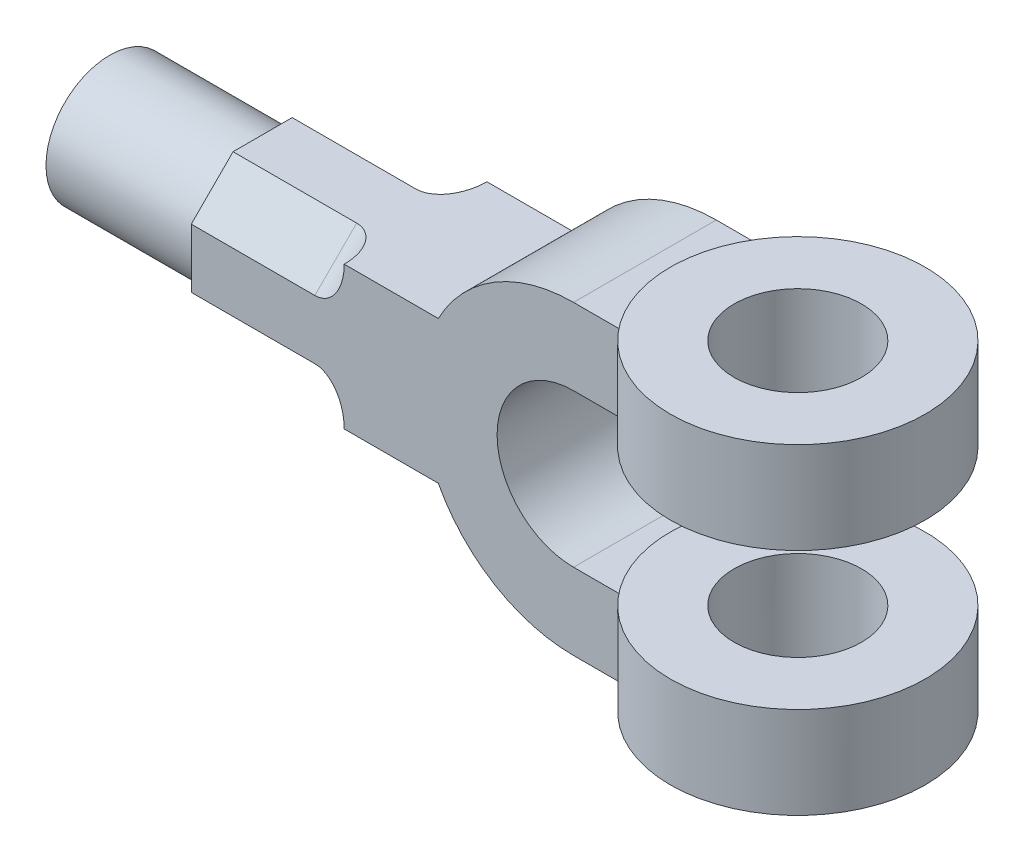
ISO-10303-21;
HEADER;
FILE_DESCRIPTION(('STEP AP214'),'2;1');
FILE_NAME('part.step','',(''),(''),'','','');
FILE_SCHEMA(('AUTOMOTIVE_DESIGN { 1 0 10303 214 1 1 1 1 }'));
ENDSEC;
DATA;
#1=APPLICATION_CONTEXT('core data for automotive mechanical design processes');
#2=APPLICATION_PROTOCOL_DEFINITION('international standard','automotive_design',2000,#1);
#3=PRODUCT_CONTEXT('',#1,'mechanical');
#4=PRODUCT('Part','Part','',(#3));
#5=PRODUCT_RELATED_PRODUCT_CATEGORY('part','',(#4));
#6=PRODUCT_DEFINITION_FORMATION('','',#4);
#7=PRODUCT_DEFINITION_CONTEXT('part definition',#1,'design');
#8=PRODUCT_DEFINITION('design','',#6,#7);
#9=PRODUCT_DEFINITION_SHAPE('','',#8);
#10=(LENGTH_UNIT() NAMED_UNIT(*) SI_UNIT(.MILLI.,.METRE.));
#11=(NAMED_UNIT(*) PLANE_ANGLE_UNIT() SI_UNIT($,.RADIAN.));
#12=(NAMED_UNIT(*) SI_UNIT($,.STERADIAN.) SOLID_ANGLE_UNIT());
#13=UNCERTAINTY_MEASURE_WITH_UNIT(LENGTH_MEASURE(1.E-05),#10,'distance_accuracy_value','');
#14=(GEOMETRIC_REPRESENTATION_CONTEXT(3) GLOBAL_UNCERTAINTY_ASSIGNED_CONTEXT((#13)) GLOBAL_UNIT_ASSIGNED_CONTEXT((#10,
#11,#12)) REPRESENTATION_CONTEXT('',''));
#15=CARTESIAN_POINT('',(0.,0.,0.));
#16=DIRECTION('',(0.,0.,1.));
#17=DIRECTION('',(1.,0.,0.));
#18=AXIS2_PLACEMENT_3D('',#15,#16,#17);
#19=CARTESIAN_POINT('',(-50.75,-6.96535892843431,20.9653589284343));
#20=DIRECTION('',(0.,0.707106781186548,0.707106781186547));
#21=DIRECTION('',(0.,-0.707106781186547,0.707106781186548));
#22=AXIS2_PLACEMENT_3D('',#19,#20,#21);
#23=CYLINDRICAL_SURFACE('',#22,5.75);
#24=DIRECTION('',(0.,-0.707106781186548,-0.707106781186547));
#25=VECTOR('',#24,1.);
#26=CARTESIAN_POINT('',(-45.,-6.96535892843431,20.9653589284343));
#27=LINE('',#26,#25);
#28=CARTESIAN_POINT('',(-45.,-13.9307178568686,14.));
#29=VERTEX_POINT('',#28);
#30=CARTESIAN_POINT('',(-45.,-14.,13.9307178568686));
#31=VERTEX_POINT('',#30);
#32=EDGE_CURVE('E376',#29,#31,#27,.T.);
#33=ORIENTED_EDGE('',*,*,#32,.F.);
#34=CARTESIAN_POINT('',(-50.75,-13.9307178568686,14.));
#35=DIRECTION('',(0.,0.,-1.));
#36=DIRECTION('',(0.,1.,0.));
#37=AXIS2_PLACEMENT_3D('',#34,#35,#36);
#38=ELLIPSE('',#37,8.1317279836453,5.75);
#39=CARTESIAN_POINT('',(-50.75,-5.79898987322333,14.));
#40=VERTEX_POINT('',#39);
#41=EDGE_CURVE('E56',#29,#40,#38,.F.);
#42=ORIENTED_EDGE('',*,*,#41,.T.);
#43=DIRECTION('',(0.,-0.707106781186548,-0.707106781186547));
#44=VECTOR('',#43,1.);
#45=CARTESIAN_POINT('',(-50.75,-2.89949493661166,16.8994949366117));
#46=LINE('',#45,#44);
#47=CARTESIAN_POINT('',(-50.75,-14.,5.79898987322333));
#48=VERTEX_POINT('',#47);
#49=EDGE_CURVE('E379',#48,#40,#46,.F.);
#50=ORIENTED_EDGE('',*,*,#49,.F.);
#51=CARTESIAN_POINT('',(-50.75,-14.,13.9307178568686));
#52=DIRECTION('',(0.,-1.,0.));
#53=DIRECTION('',(0.,0.,1.));
#54=AXIS2_PLACEMENT_3D('',#51,#52,#53);
#55=ELLIPSE('',#54,8.13172798364529,5.75);
#56=EDGE_CURVE('E38',#48,#31,#55,.T.);
#57=ORIENTED_EDGE('',*,*,#56,.T.);
#58=EDGE_LOOP('',(#33,#42,#50,#57));
#59=FACE_BOUND('',#58,.T.);
#60=ADVANCED_FACE('F35',(#59),#23,.F.);
#61=CARTESIAN_POINT('',(-50.75,-20.9653589284343,-6.9653589284343));
#62=DIRECTION('',(0.,-0.707106781186547,0.707106781186548));
#63=DIRECTION('',(0.,-0.707106781186548,-0.707106781186547));
#64=AXIS2_PLACEMENT_3D('',#61,#62,#63);
#65=CYLINDRICAL_SURFACE('',#64,5.75);
#66=DIRECTION('',(0.,0.707106781186547,-0.707106781186548));
#67=VECTOR('',#66,1.);
#68=CARTESIAN_POINT('',(-45.,-20.9653589284343,-6.9653589284343));
#69=LINE('',#68,#67);
#70=CARTESIAN_POINT('',(-45.,-14.,-13.9307178568686));
#71=VERTEX_POINT('',#70);
#72=CARTESIAN_POINT('',(-45.,-13.9307178568686,-14.));
#73=VERTEX_POINT('',#72);
#74=EDGE_CURVE('E366',#71,#73,#69,.T.);
#75=ORIENTED_EDGE('',*,*,#74,.F.);
#76=CARTESIAN_POINT('',(-50.75,-14.,-13.9307178568686));
#77=DIRECTION('',(0.,-1.,0.));
#78=DIRECTION('',(0.,0.,1.));
#79=AXIS2_PLACEMENT_3D('',#76,#77,#78);
#80=ELLIPSE('',#79,8.1317279836453,5.75);
#81=CARTESIAN_POINT('',(-50.75,-14.,-5.79898987322332));
#82=VERTEX_POINT('',#81);
#83=EDGE_CURVE('E372',#71,#82,#80,.T.);
#84=ORIENTED_EDGE('',*,*,#83,.T.);
#85=DIRECTION('',(0.,0.707106781186547,-0.707106781186548));
#86=VECTOR('',#85,1.);
#87=CARTESIAN_POINT('',(-50.75,-16.8994949366117,-2.89949493661166));
#88=LINE('',#87,#86);
#89=CARTESIAN_POINT('',(-50.75,-5.79898987322334,-14.));
#90=VERTEX_POINT('',#89);
#91=EDGE_CURVE('E369',#90,#82,#88,.F.);
#92=ORIENTED_EDGE('',*,*,#91,.F.);
#93=CARTESIAN_POINT('',(-50.75,-13.9307178568686,-14.));
#94=DIRECTION('',(0.,0.,1.));
#95=DIRECTION('',(0.,-1.,0.));
#96=AXIS2_PLACEMENT_3D('',#93,#94,#95);
#97=ELLIPSE('',#96,8.13172798364529,5.75);
#98=EDGE_CURVE('E374',#90,#73,#97,.F.);
#99=ORIENTED_EDGE('',*,*,#98,.T.);
#100=EDGE_LOOP('',(#75,#84,#92,#99));
#101=FACE_BOUND('',#100,.T.);
#102=ADVANCED_FACE('F472',(#101),#65,.F.);
#103=CARTESIAN_POINT('',(-50.75,6.96535892843432,20.9653589284343));
#104=DIRECTION('',(0.,0.707106781186547,-0.707106781186548));
#105=DIRECTION('',(0.,0.707106781186548,0.707106781186547));
#106=AXIS2_PLACEMENT_3D('',#103,#104,#105);
#107=CYLINDRICAL_SURFACE('',#106,5.75);
#108=DIRECTION('',(0.,-0.707106781186547,0.707106781186548));
#109=VECTOR('',#108,1.);
#110=CARTESIAN_POINT('',(-45.,6.96535892843432,20.9653589284343));
#111=LINE('',#110,#109);
#112=CARTESIAN_POINT('',(-45.,14.,13.9307178568686));
#113=VERTEX_POINT('',#112);
#114=CARTESIAN_POINT('',(-45.,13.9307178568686,14.));
#115=VERTEX_POINT('',#114);
#116=EDGE_CURVE('E358',#113,#115,#111,.T.);
#117=ORIENTED_EDGE('',*,*,#116,.F.);
#118=CARTESIAN_POINT('',(-50.75,14.,13.9307178568686));
#119=DIRECTION('',(0.,-1.,0.));
#120=DIRECTION('',(0.,0.,-1.));
#121=AXIS2_PLACEMENT_3D('',#118,#119,#120);
#122=ELLIPSE('',#121,8.1317279836453,5.75);
#123=CARTESIAN_POINT('',(-50.75,14.,5.79898987322333));
#124=VERTEX_POINT('',#123);
#125=EDGE_CURVE('E362',#113,#124,#122,.F.);
#126=ORIENTED_EDGE('',*,*,#125,.T.);
#127=DIRECTION('',(0.,-0.707106781186547,0.707106781186548));
#128=VECTOR('',#127,1.);
#129=CARTESIAN_POINT('',(-50.75,2.89949493661167,16.8994949366117));
#130=LINE('',#129,#128);
#131=CARTESIAN_POINT('',(-50.75,5.79898987322333,14.));
#132=VERTEX_POINT('',#131);
#133=EDGE_CURVE('E221',#132,#124,#130,.F.);
#134=ORIENTED_EDGE('',*,*,#133,.F.);
#135=CARTESIAN_POINT('',(-50.75,13.9307178568686,14.));
#136=DIRECTION('',(0.,0.,-1.));
#137=DIRECTION('',(0.,1.,0.));
#138=AXIS2_PLACEMENT_3D('',#135,#136,#137);
#139=ELLIPSE('',#138,8.13172798364529,5.75);
#140=EDGE_CURVE('E364',#132,#115,#139,.F.);
#141=ORIENTED_EDGE('',*,*,#140,.T.);
#142=EDGE_LOOP('',(#117,#126,#134,#141));
#143=FACE_BOUND('',#142,.T.);
#144=ADVANCED_FACE('F500',(#143),#107,.F.);
#145=CARTESIAN_POINT('',(-50.75,20.9653589284343,-6.96535892843432));
#146=DIRECTION('',(0.,-0.707106781186548,-0.707106781186547));
#147=DIRECTION('',(0.,0.707106781186547,-0.707106781186548));
#148=AXIS2_PLACEMENT_3D('',#145,#146,#147);
#149=CYLINDRICAL_SURFACE('',#148,5.75);
#150=DIRECTION('',(0.,0.707106781186548,0.707106781186547));
#151=VECTOR('',#150,1.);
#152=CARTESIAN_POINT('',(-45.,20.9653589284343,-6.96535892843432));
#153=LINE('',#152,#151);
#154=CARTESIAN_POINT('',(-45.,13.9307178568686,-14.));
#155=VERTEX_POINT('',#154);
#156=CARTESIAN_POINT('',(-45.,14.,-13.9307178568686));
#157=VERTEX_POINT('',#156);
#158=EDGE_CURVE('E346',#155,#157,#153,.T.);
#159=ORIENTED_EDGE('',*,*,#158,.F.);
#160=CARTESIAN_POINT('',(-50.75,13.9307178568686,-14.));
#161=DIRECTION('',(0.,0.,1.));
#162=DIRECTION('',(0.,-1.,0.));
#163=AXIS2_PLACEMENT_3D('',#160,#161,#162);
#164=ELLIPSE('',#163,8.1317279836453,5.75);
#165=CARTESIAN_POINT('',(-50.75,5.79898987322332,-14.));
#166=VERTEX_POINT('',#165);
#167=EDGE_CURVE('E354',#155,#166,#164,.F.);
#168=ORIENTED_EDGE('',*,*,#167,.T.);
#169=DIRECTION('',(0.,0.707106781186548,0.707106781186547));
#170=VECTOR('',#169,1.);
#171=CARTESIAN_POINT('',(-50.75,16.8994949366117,-2.89949493661167));
#172=LINE('',#171,#170);
#173=CARTESIAN_POINT('',(-50.75,14.,-5.79898987322333));
#174=VERTEX_POINT('',#173);
#175=EDGE_CURVE('E351',#174,#166,#172,.F.);
#176=ORIENTED_EDGE('',*,*,#175,.F.);
#177=CARTESIAN_POINT('',(-50.75,14.,-13.9307178568686));
#178=DIRECTION('',(0.,-1.,0.));
#179=DIRECTION('',(0.,0.,-1.));
#180=AXIS2_PLACEMENT_3D('',#177,#178,#179);
#181=ELLIPSE('',#180,8.13172798364529,5.75);
#182=EDGE_CURVE('E356',#174,#157,#181,.F.);
#183=ORIENTED_EDGE('',*,*,#182,.T.);
#184=EDGE_LOOP('',(#159,#168,#176,#183));
#185=FACE_BOUND('',#184,.T.);
#186=ADVANCED_FACE('F422',(#185),#149,.F.);
#187=CARTESIAN_POINT('',(-45.,0.,14.));
#188=DIRECTION('',(1.,0.,0.));
#189=DIRECTION('',(0.,0.,-1.));
#190=AXIS2_PLACEMENT_3D('',#187,#188,#189);
#191=PLANE('',#190);
#192=DIRECTION('',(0.,0.,-1.));
#193=VECTOR('',#192,1.);
#194=CARTESIAN_POINT('',(-45.,14.,14.));
#195=LINE('',#194,#193);
#196=CARTESIAN_POINT('',(-45.,14.,14.));
#197=VERTEX_POINT('',#196);
#198=EDGE_CURVE('E306',#197,#113,#195,.T.);
#199=ORIENTED_EDGE('',*,*,#198,.T.);
#200=ORIENTED_EDGE('',*,*,#116,.T.);
#201=DIRECTION('',(0.,-1.,0.));
#202=VECTOR('',#201,1.);
#203=CARTESIAN_POINT('',(-45.,0.,14.));
#204=LINE('',#203,#202);
#205=EDGE_CURVE('E300',#197,#115,#204,.T.);
#206=ORIENTED_EDGE('',*,*,#205,.F.);
#207=EDGE_LOOP('',(#199,#200,#206));
#208=FACE_BOUND('',#207,.T.);
#209=ADVANCED_FACE('F509',(#208),#191,.F.);
#210=CARTESIAN_POINT('',(-45.,-14.,14.));
#211=VERTEX_POINT('',#210);
#212=EDGE_CURVE('E323',#29,#211,#204,.T.);
#213=ORIENTED_EDGE('',*,*,#212,.F.);
#214=ORIENTED_EDGE('',*,*,#32,.T.);
#215=DIRECTION('',(0.,0.,-1.));
#216=VECTOR('',#215,1.);
#217=CARTESIAN_POINT('',(-45.,-14.,14.));
#218=LINE('',#217,#216);
#219=EDGE_CURVE('E289',#211,#31,#218,.T.);
#220=ORIENTED_EDGE('',*,*,#219,.F.);
#221=EDGE_LOOP('',(#213,#214,#220));
#222=FACE_BOUND('',#221,.T.);
#223=ADVANCED_FACE('F384',(#222),#191,.F.);
#224=CARTESIAN_POINT('',(-45.,-14.,-14.));
#225=VERTEX_POINT('',#224);
#226=EDGE_CURVE('E312',#71,#225,#218,.T.);
#227=ORIENTED_EDGE('',*,*,#226,.F.);
#228=ORIENTED_EDGE('',*,*,#74,.T.);
#229=DIRECTION('',(0.,-1.,0.));
#230=VECTOR('',#229,1.);
#231=CARTESIAN_POINT('',(-45.,0.,-14.));
#232=LINE('',#231,#230);
#233=EDGE_CURVE('E261',#73,#225,#232,.T.);
#234=ORIENTED_EDGE('',*,*,#233,.T.);
#235=EDGE_LOOP('',(#227,#228,#234));
#236=FACE_BOUND('',#235,.T.);
#237=ADVANCED_FACE('F468',(#236),#191,.F.);
#238=CARTESIAN_POINT('',(-45.,14.,-14.));
#239=VERTEX_POINT('',#238);
#240=EDGE_CURVE('E315',#239,#155,#232,.T.);
#241=ORIENTED_EDGE('',*,*,#240,.T.);
#242=ORIENTED_EDGE('',*,*,#158,.T.);
#243=EDGE_CURVE('E310',#157,#239,#195,.T.);
#244=ORIENTED_EDGE('',*,*,#243,.T.);
#245=EDGE_LOOP('',(#241,#242,#244));
#246=FACE_BOUND('',#245,.T.);
#247=ADVANCED_FACE('F425',(#246),#191,.F.);
#248=CARTESIAN_POINT('',(29.9999999999999,-66.5,0.));
#249=DIRECTION('',(0.,1.,0.));
#250=DIRECTION('',(0.,0.,1.));
#251=AXIS2_PLACEMENT_3D('',#248,#249,#250);
#252=CYLINDRICAL_SURFACE('',#251,25.);
#253=CARTESIAN_POINT('',(29.9999999999999,-13.5,0.));
#254=DIRECTION('',(0.,1.,0.));
#255=DIRECTION('',(0.,0.,1.));
#256=AXIS2_PLACEMENT_3D('',#253,#254,#255);
#257=CIRCLE('',#256,25.);
#258=CARTESIAN_POINT('',(29.9999999999999,-13.5,25.));
#259=VERTEX_POINT('',#258);
#260=EDGE_CURVE('E339',#259,#259,#257,.T.);
#261=ORIENTED_EDGE('',*,*,#260,.F.);
#262=EDGE_LOOP('',(#261));
#263=FACE_BOUND('',#262,.T.);
#264=CARTESIAN_POINT('',(29.9999999999999,-31.5,0.));
#265=DIRECTION('',(0.,1.,0.));
#266=DIRECTION('',(-1.,0.,0.));
#267=AXIS2_PLACEMENT_3D('',#264,#265,#266);
#268=CIRCLE('',#267,25.);
#269=CARTESIAN_POINT('',(4.99999999999988,-31.5,0.));
#270=VERTEX_POINT('',#269);
#271=EDGE_CURVE('E336',#270,#270,#268,.T.);
#272=ORIENTED_EDGE('',*,*,#271,.T.);
#273=EDGE_LOOP('',(#272));
#274=FACE_BOUND('',#273,.T.);
#275=DIRECTION('',(0.,-1.,0.));
#276=VECTOR('',#275,1.);
#277=CARTESIAN_POINT('',(9.28768482279188,-15.,-14.));
#278=LINE('',#277,#276);
#279=CARTESIAN_POINT('',(9.28768482279188,-15.,-14.));
#280=VERTEX_POINT('',#279);
#281=CARTESIAN_POINT('',(9.28768482279187,-30.,-14.));
#282=VERTEX_POINT('',#281);
#283=EDGE_CURVE('E222',#280,#282,#278,.T.);
#284=ORIENTED_EDGE('',*,*,#283,.F.);
#285=CARTESIAN_POINT('',(29.9999999999999,-15.,0.));
#286=DIRECTION('',(0.,-1.,0.));
#287=DIRECTION('',(1.,0.,0.));
#288=AXIS2_PLACEMENT_3D('',#285,#286,#287);
#289=CIRCLE('',#288,25.);
#290=CARTESIAN_POINT('',(9.2876848227919,-15.,14.));
#291=VERTEX_POINT('',#290);
#292=EDGE_CURVE('E325',#291,#280,#289,.T.);
#293=ORIENTED_EDGE('',*,*,#292,.F.);
#294=DIRECTION('',(0.,-1.,0.));
#295=VECTOR('',#294,1.);
#296=CARTESIAN_POINT('',(9.28768482279188,-15.,14.));
#297=LINE('',#296,#295);
#298=CARTESIAN_POINT('',(9.28768482279187,-30.,14.));
#299=VERTEX_POINT('',#298);
#300=EDGE_CURVE('E331',#291,#299,#297,.T.);
#301=ORIENTED_EDGE('',*,*,#300,.T.);
#302=CARTESIAN_POINT('',(29.9999999999999,-30.,0.));
#303=DIRECTION('',(0.,-1.,0.));
#304=DIRECTION('',(1.,0.,0.));
#305=AXIS2_PLACEMENT_3D('',#302,#303,#304);
#306=CIRCLE('',#305,25.);
#307=EDGE_CURVE('E305',#299,#282,#306,.T.);
#308=ORIENTED_EDGE('',*,*,#307,.T.);
#309=EDGE_LOOP('',(#284,#293,#301,#308));
#310=FACE_BOUND('',#309,.T.);
#311=ADVANCED_FACE('F456',(#263,#274,#310),#252,.T.);
#312=CARTESIAN_POINT('',(29.9999999999999,-66.5,0.));
#313=DIRECTION('',(0.,1.,0.));
#314=DIRECTION('',(0.,0.,1.));
#315=AXIS2_PLACEMENT_3D('',#312,#313,#314);
#316=CYLINDRICAL_SURFACE('',#315,12.5);
#317=CARTESIAN_POINT('',(29.9999999999999,-13.5,0.));
#318=DIRECTION('',(0.,1.,0.));
#319=DIRECTION('',(0.,0.,1.));
#320=AXIS2_PLACEMENT_3D('',#317,#318,#319);
#321=CIRCLE('',#320,12.5);
#322=CARTESIAN_POINT('',(29.9999999999999,-13.5,12.5));
#323=VERTEX_POINT('',#322);
#324=EDGE_CURVE('E343',#323,#323,#321,.T.);
#325=ORIENTED_EDGE('',*,*,#324,.T.);
#326=EDGE_LOOP('',(#325));
#327=FACE_BOUND('',#326,.T.);
#328=CARTESIAN_POINT('',(29.9999999999999,-31.5,0.));
#329=DIRECTION('',(0.,1.,0.));
#330=DIRECTION('',(-1.,0.,0.));
#331=AXIS2_PLACEMENT_3D('',#328,#329,#330);
#332=CIRCLE('',#331,12.5);
#333=CARTESIAN_POINT('',(17.4999999999999,-31.5,0.));
#334=VERTEX_POINT('',#333);
#335=EDGE_CURVE('E342',#334,#334,#332,.T.);
#336=ORIENTED_EDGE('',*,*,#335,.F.);
#337=EDGE_LOOP('',(#336));
#338=FACE_BOUND('',#337,.T.);
#339=ADVANCED_FACE('F517',(#327,#338),#316,.F.);
#340=CARTESIAN_POINT('',(0.,-31.5,25.));
#341=DIRECTION('',(0.,1.,0.));
#342=DIRECTION('',(-1.,0.,0.));
#343=AXIS2_PLACEMENT_3D('',#340,#341,#342);
#344=PLANE('',#343);
#345=ORIENTED_EDGE('',*,*,#335,.T.);
#346=EDGE_LOOP('',(#345));
#347=FACE_BOUND('',#346,.T.);
#348=ORIENTED_EDGE('',*,*,#271,.F.);
#349=EDGE_LOOP('',(#348));
#350=FACE_BOUND('',#349,.T.);
#351=ADVANCED_FACE('F513',(#347,#350),#344,.F.);
#352=CARTESIAN_POINT('',(0.,-13.5,25.));
#353=DIRECTION('',(0.,1.,0.));
#354=DIRECTION('',(0.,0.,1.));
#355=AXIS2_PLACEMENT_3D('',#352,#353,#354);
#356=PLANE('',#355);
#357=ORIENTED_EDGE('',*,*,#324,.F.);
#358=EDGE_LOOP('',(#357));
#359=FACE_BOUND('',#358,.T.);
#360=ORIENTED_EDGE('',*,*,#260,.T.);
#361=EDGE_LOOP('',(#360));
#362=FACE_BOUND('',#361,.T.);
#363=ADVANCED_FACE('F510',(#359,#362),#356,.T.);
#364=CARTESIAN_POINT('',(0.,-15.,14.));
#365=DIRECTION('',(0.,0.,-1.));
#366=DIRECTION('',(-1.,0.,0.));
#367=AXIS2_PLACEMENT_3D('',#364,#365,#366);
#368=PLANE('',#367);
#369=ORIENTED_EDGE('',*,*,#41,.F.);
#370=ORIENTED_EDGE('',*,*,#212,.T.);
#371=DIRECTION('',(-1.,0.,0.));
#372=VECTOR('',#371,1.);
#373=CARTESIAN_POINT('',(0.,-14.,14.));
#374=LINE('',#373,#372);
#375=CARTESIAN_POINT('',(-26.5329983228432,-14.,14.));
#376=VERTEX_POINT('',#375);
#377=EDGE_CURVE('E309',#376,#211,#374,.T.);
#378=ORIENTED_EDGE('',*,*,#377,.F.);
#379=CARTESIAN_POINT('',(0.,0.,14.));
#380=DIRECTION('',(0.,0.,1.));
#381=DIRECTION('',(1.,0.,0.));
#382=AXIS2_PLACEMENT_3D('',#379,#380,#381);
#383=CIRCLE('',#382,30.);
#384=CARTESIAN_POINT('',(-1.04744438364601E-13,-30.,14.));
#385=VERTEX_POINT('',#384);
#386=EDGE_CURVE('E295',#376,#385,#383,.T.);
#387=ORIENTED_EDGE('',*,*,#386,.T.);
#388=DIRECTION('',(1.,0.,0.));
#389=VECTOR('',#388,1.);
#390=CARTESIAN_POINT('',(0.,-30.,14.));
#391=LINE('',#390,#389);
#392=EDGE_CURVE('E328',#385,#299,#391,.T.);
#393=ORIENTED_EDGE('',*,*,#392,.T.);
#394=ORIENTED_EDGE('',*,*,#300,.F.);
#395=DIRECTION('',(1.,0.,0.));
#396=VECTOR('',#395,1.);
#397=CARTESIAN_POINT('',(0.,-15.,14.));
#398=LINE('',#397,#396);
#399=CARTESIAN_POINT('',(0.,-15.,14.));
#400=VERTEX_POINT('',#399);
#401=EDGE_CURVE('E327',#400,#291,#398,.T.);
#402=ORIENTED_EDGE('',*,*,#401,.F.);
#403=CARTESIAN_POINT('',(0.,0.,14.));
#404=DIRECTION('',(0.,0.,1.));
#405=DIRECTION('',(1.,0.,0.));
#406=AXIS2_PLACEMENT_3D('',#403,#404,#405);
#407=CIRCLE('',#406,15.);
#408=CARTESIAN_POINT('',(0.,15.,14.));
#409=VERTEX_POINT('',#408);
#410=EDGE_CURVE('E264',#409,#400,#407,.T.);
#411=ORIENTED_EDGE('',*,*,#410,.F.);
#412=DIRECTION('',(1.,0.,0.));
#413=VECTOR('',#412,1.);
#414=CARTESIAN_POINT('',(0.,15.,14.));
#415=LINE('',#414,#413);
#416=CARTESIAN_POINT('',(9.2876848227919,15.,14.));
#417=VERTEX_POINT('',#416);
#418=EDGE_CURVE('E292',#409,#417,#415,.T.);
#419=ORIENTED_EDGE('',*,*,#418,.T.);
#420=DIRECTION('',(0.,1.,0.));
#421=VECTOR('',#420,1.);
#422=CARTESIAN_POINT('',(9.2876848227919,15.,14.));
#423=LINE('',#422,#421);
#424=CARTESIAN_POINT('',(9.2876848227919,30.,14.));
#425=VERTEX_POINT('',#424);
#426=EDGE_CURVE('E249',#417,#425,#423,.T.);
#427=ORIENTED_EDGE('',*,*,#426,.T.);
#428=DIRECTION('',(1.,0.,0.));
#429=VECTOR('',#428,1.);
#430=CARTESIAN_POINT('',(0.,30.,14.));
#431=LINE('',#430,#429);
#432=CARTESIAN_POINT('',(-1.04744438364602E-13,30.,14.));
#433=VERTEX_POINT('',#432);
#434=EDGE_CURVE('E269',#433,#425,#431,.T.);
#435=ORIENTED_EDGE('',*,*,#434,.F.);
#436=CARTESIAN_POINT('',(0.,0.,14.));
#437=DIRECTION('',(0.,0.,1.));
#438=DIRECTION('',(1.,0.,0.));
#439=AXIS2_PLACEMENT_3D('',#436,#437,#438);
#440=CIRCLE('',#439,30.);
#441=CARTESIAN_POINT('',(-26.5329983228432,14.,14.));
#442=VERTEX_POINT('',#441);
#443=EDGE_CURVE('E273',#433,#442,#440,.T.);
#444=ORIENTED_EDGE('',*,*,#443,.T.);
#445=DIRECTION('',(-1.,0.,0.));
#446=VECTOR('',#445,1.);
#447=CARTESIAN_POINT('',(0.,14.,14.));
#448=LINE('',#447,#446);
#449=EDGE_CURVE('E302',#442,#197,#448,.T.);
#450=ORIENTED_EDGE('',*,*,#449,.T.);
#451=ORIENTED_EDGE('',*,*,#205,.T.);
#452=ORIENTED_EDGE('',*,*,#140,.F.);
#453=DIRECTION('',(1.,0.,0.));
#454=VECTOR('',#453,1.);
#455=CARTESIAN_POINT('',(-75.,5.79898987322333,14.));
#456=LINE('',#455,#454);
#457=CARTESIAN_POINT('',(-75.,5.79898987322333,14.));
#458=VERTEX_POINT('',#457);
#459=EDGE_CURVE('E398',#458,#132,#456,.T.);
#460=ORIENTED_EDGE('',*,*,#459,.F.);
#461=DIRECTION('',(0.,1.,0.));
#462=VECTOR('',#461,1.);
#463=CARTESIAN_POINT('',(-75.,-5.79898987322333,14.));
#464=LINE('',#463,#462);
#465=CARTESIAN_POINT('',(-75.,-5.79898987322333,14.));
#466=VERTEX_POINT('',#465);
#467=EDGE_CURVE('E212',#466,#458,#464,.T.);
#468=ORIENTED_EDGE('',*,*,#467,.F.);
#469=DIRECTION('',(1.,0.,0.));
#470=VECTOR('',#469,1.);
#471=CARTESIAN_POINT('',(-75.,-5.79898987322333,14.));
#472=LINE('',#471,#470);
#473=EDGE_CURVE('E394',#466,#40,#472,.T.);
#474=ORIENTED_EDGE('',*,*,#473,.T.);
#475=EDGE_LOOP('',(#369,#370,#378,#387,#393,#394,#402,#411,#419,#427,#435,#444,#450,#451,#452,
#460,#468,#474));
#476=FACE_BOUND('',#475,.T.);
#477=ADVANCED_FACE('F390',(#476),#368,.F.);
#478=CARTESIAN_POINT('',(0.,-15.,0.));
#479=DIRECTION('',(0.,-1.,0.));
#480=DIRECTION('',(1.,0.,0.));
#481=AXIS2_PLACEMENT_3D('',#478,#479,#480);
#482=PLANE('',#481);
#483=ORIENTED_EDGE('',*,*,#292,.T.);
#484=DIRECTION('',(1.,0.,0.));
#485=VECTOR('',#484,1.);
#486=CARTESIAN_POINT('',(0.,-15.,-14.));
#487=LINE('',#486,#485);
#488=CARTESIAN_POINT('',(0.,-15.,-14.));
#489=VERTEX_POINT('',#488);
#490=EDGE_CURVE('E282',#489,#280,#487,.T.);
#491=ORIENTED_EDGE('',*,*,#490,.F.);
#492=DIRECTION('',(0.,0.,-1.));
#493=VECTOR('',#492,1.);
#494=CARTESIAN_POINT('',(0.,-15.,14.));
#495=LINE('',#494,#493);
#496=EDGE_CURVE('E271',#400,#489,#495,.T.);
#497=ORIENTED_EDGE('',*,*,#496,.F.);
#498=ORIENTED_EDGE('',*,*,#401,.T.);
#499=EDGE_LOOP('',(#483,#491,#497,#498));
#500=FACE_BOUND('',#499,.T.);
#501=ADVANCED_FACE('F527',(#500),#482,.F.);
#502=CARTESIAN_POINT('',(0.,-30.,0.));
#503=DIRECTION('',(0.,-1.,0.));
#504=DIRECTION('',(1.,0.,0.));
#505=AXIS2_PLACEMENT_3D('',#502,#503,#504);
#506=PLANE('',#505);
#507=ORIENTED_EDGE('',*,*,#307,.F.);
#508=ORIENTED_EDGE('',*,*,#392,.F.);
#509=DIRECTION('',(0.,0.,-1.));
#510=VECTOR('',#509,1.);
#511=CARTESIAN_POINT('',(-1.04744438364601E-13,-30.,14.));
#512=LINE('',#511,#510);
#513=CARTESIAN_POINT('',(-1.04744438364601E-13,-30.,-14.));
#514=VERTEX_POINT('',#513);
#515=EDGE_CURVE('E266',#385,#514,#512,.T.);
#516=ORIENTED_EDGE('',*,*,#515,.T.);
#517=DIRECTION('',(1.,0.,0.));
#518=VECTOR('',#517,1.);
#519=CARTESIAN_POINT('',(0.,-30.,-14.));
#520=LINE('',#519,#518);
#521=EDGE_CURVE('E270',#514,#282,#520,.T.);
#522=ORIENTED_EDGE('',*,*,#521,.T.);
#523=EDGE_LOOP('',(#507,#508,#516,#522));
#524=FACE_BOUND('',#523,.T.);
#525=ADVANCED_FACE('F460',(#524),#506,.T.);
#526=CARTESIAN_POINT('',(29.9999999999999,-66.5,0.));
#527=DIRECTION('',(0.,1.,0.));
#528=DIRECTION('',(0.,0.,1.));
#529=AXIS2_PLACEMENT_3D('',#526,#527,#528);
#530=CYLINDRICAL_SURFACE('',#529,25.);
#531=CARTESIAN_POINT('',(29.9999999999999,13.5,0.));
#532=DIRECTION('',(0.,1.,0.));
#533=DIRECTION('',(0.,0.,1.));
#534=AXIS2_PLACEMENT_3D('',#531,#532,#533);
#535=CIRCLE('',#534,25.);
#536=CARTESIAN_POINT('',(29.9999999999999,13.5,25.));
#537=VERTEX_POINT('',#536);
#538=EDGE_CURVE('E240',#537,#537,#535,.T.);
#539=ORIENTED_EDGE('',*,*,#538,.T.);
#540=EDGE_LOOP('',(#539));
#541=FACE_BOUND('',#540,.T.);
#542=CARTESIAN_POINT('',(29.9999999999999,31.5,0.));
#543=DIRECTION('',(0.,1.,0.));
#544=DIRECTION('',(0.,0.,1.));
#545=AXIS2_PLACEMENT_3D('',#542,#543,#544);
#546=CIRCLE('',#545,25.);
#547=CARTESIAN_POINT('',(29.9999999999999,31.5,25.));
#548=VERTEX_POINT('',#547);
#549=EDGE_CURVE('E236',#548,#548,#546,.T.);
#550=ORIENTED_EDGE('',*,*,#549,.F.);
#551=EDGE_LOOP('',(#550));
#552=FACE_BOUND('',#551,.T.);
#553=CARTESIAN_POINT('',(29.9999999999999,15.,0.));
#554=DIRECTION('',(0.,1.,0.));
#555=DIRECTION('',(-1.,0.,0.));
#556=AXIS2_PLACEMENT_3D('',#553,#554,#555);
#557=CIRCLE('',#556,25.);
#558=CARTESIAN_POINT('',(9.2876848227919,15.,-14.));
#559=VERTEX_POINT('',#558);
#560=EDGE_CURVE('E246',#417,#559,#557,.F.);
#561=ORIENTED_EDGE('',*,*,#560,.T.);
#562=DIRECTION('',(0.,1.,0.));
#563=VECTOR('',#562,1.);
#564=CARTESIAN_POINT('',(9.28768482279191,15.,-14.));
#565=LINE('',#564,#563);
#566=CARTESIAN_POINT('',(9.2876848227919,30.,-14.));
#567=VERTEX_POINT('',#566);
#568=EDGE_CURVE('E225',#559,#567,#565,.T.);
#569=ORIENTED_EDGE('',*,*,#568,.T.);
#570=CARTESIAN_POINT('',(29.9999999999999,30.,0.));
#571=DIRECTION('',(0.,1.,0.));
#572=DIRECTION('',(-1.,0.,0.));
#573=AXIS2_PLACEMENT_3D('',#570,#571,#572);
#574=CIRCLE('',#573,25.);
#575=EDGE_CURVE('E243',#425,#567,#574,.F.);
#576=ORIENTED_EDGE('',*,*,#575,.F.);
#577=ORIENTED_EDGE('',*,*,#426,.F.);
#578=EDGE_LOOP('',(#561,#569,#576,#577));
#579=FACE_BOUND('',#578,.T.);
#580=ADVANCED_FACE('F442',(#541,#552,#579),#530,.T.);
#581=CARTESIAN_POINT('',(0.,0.,14.));
#582=DIRECTION('',(0.,0.,-1.));
#583=DIRECTION('',(-1.,0.,0.));
#584=AXIS2_PLACEMENT_3D('',#581,#582,#583);
#585=CYLINDRICAL_SURFACE('',#584,30.);
#586=CARTESIAN_POINT('',(0.,0.,-14.));
#587=DIRECTION('',(0.,0.,1.));
#588=DIRECTION('',(1.,0.,0.));
#589=AXIS2_PLACEMENT_3D('',#586,#587,#588);
#590=CIRCLE('',#589,30.);
#591=CARTESIAN_POINT('',(-1.04744438364602E-13,30.,-14.));
#592=VERTEX_POINT('',#591);
#593=CARTESIAN_POINT('',(-26.5329983228432,14.,-14.));
#594=VERTEX_POINT('',#593);
#595=EDGE_CURVE('E254',#592,#594,#590,.T.);
#596=ORIENTED_EDGE('',*,*,#595,.T.);
#597=DIRECTION('',(0.,0.,-1.));
#598=VECTOR('',#597,1.);
#599=CARTESIAN_POINT('',(-26.5329983228432,14.,14.));
#600=LINE('',#599,#598);
#601=EDGE_CURVE('E258',#442,#594,#600,.T.);
#602=ORIENTED_EDGE('',*,*,#601,.F.);
#603=ORIENTED_EDGE('',*,*,#443,.F.);
#604=DIRECTION('',(0.,0.,-1.));
#605=VECTOR('',#604,1.);
#606=CARTESIAN_POINT('',(-1.04744438364602E-13,30.,14.));
#607=LINE('',#606,#605);
#608=EDGE_CURVE('E255',#433,#592,#607,.T.);
#609=ORIENTED_EDGE('',*,*,#608,.T.);
#610=EDGE_LOOP('',(#596,#602,#603,#609));
#611=FACE_BOUND('',#610,.T.);
#612=ADVANCED_FACE('F434',(#611),#585,.T.);
#613=CARTESIAN_POINT('',(0.,14.,14.));
#614=DIRECTION('',(0.,-1.,0.));
#615=DIRECTION('',(1.,0.,0.));
#616=AXIS2_PLACEMENT_3D('',#613,#614,#615);
#617=PLANE('',#616);
#618=DIRECTION('',(-1.,0.,0.));
#619=VECTOR('',#618,1.);
#620=CARTESIAN_POINT('',(0.,14.,-14.));
#621=LINE('',#620,#619);
#622=EDGE_CURVE('E257',#594,#239,#621,.T.);
#623=ORIENTED_EDGE('',*,*,#622,.T.);
#624=ORIENTED_EDGE('',*,*,#243,.F.);
#625=ORIENTED_EDGE('',*,*,#182,.F.);
#626=DIRECTION('',(1.,0.,0.));
#627=VECTOR('',#626,1.);
#628=CARTESIAN_POINT('',(-75.,14.,-5.79898987322333));
#629=LINE('',#628,#627);
#630=CARTESIAN_POINT('',(-75.,14.,-5.79898987322333));
#631=VERTEX_POINT('',#630);
#632=EDGE_CURVE('E203',#631,#174,#629,.T.);
#633=ORIENTED_EDGE('',*,*,#632,.F.);
#634=DIRECTION('',(0.,0.,-1.));
#635=VECTOR('',#634,1.);
#636=CARTESIAN_POINT('',(-75.,14.,5.79898987322333));
#637=LINE('',#636,#635);
#638=CARTESIAN_POINT('',(-75.,14.,5.79898987322333));
#639=VERTEX_POINT('',#638);
#640=EDGE_CURVE('E196',#639,#631,#637,.T.);
#641=ORIENTED_EDGE('',*,*,#640,.F.);
#642=DIRECTION('',(1.,0.,0.));
#643=VECTOR('',#642,1.);
#644=CARTESIAN_POINT('',(-75.,14.,5.79898987322333));
#645=LINE('',#644,#643);
#646=EDGE_CURVE('E201',#639,#124,#645,.T.);
#647=ORIENTED_EDGE('',*,*,#646,.T.);
#648=ORIENTED_EDGE('',*,*,#125,.F.);
#649=ORIENTED_EDGE('',*,*,#198,.F.);
#650=ORIENTED_EDGE('',*,*,#449,.F.);
#651=ORIENTED_EDGE('',*,*,#601,.T.);
#652=EDGE_LOOP('',(#623,#624,#625,#633,#641,#647,#648,#649,#650,#651));
#653=FACE_BOUND('',#652,.T.);
#654=ADVANCED_FACE('F199',(#653),#617,.F.);
#655=CARTESIAN_POINT('',(0.,-14.,14.));
#656=DIRECTION('',(0.,-1.,0.));
#657=DIRECTION('',(1.,0.,0.));
#658=AXIS2_PLACEMENT_3D('',#655,#656,#657);
#659=PLANE('',#658);
#660=ORIENTED_EDGE('',*,*,#83,.F.);
#661=ORIENTED_EDGE('',*,*,#226,.T.);
#662=DIRECTION('',(-1.,0.,0.));
#663=VECTOR('',#662,1.);
#664=CARTESIAN_POINT('',(0.,-14.,-14.));
#665=LINE('',#664,#663);
#666=CARTESIAN_POINT('',(-26.5329983228432,-14.,-14.));
#667=VERTEX_POINT('',#666);
#668=EDGE_CURVE('E278',#667,#225,#665,.T.);
#669=ORIENTED_EDGE('',*,*,#668,.F.);
#670=DIRECTION('',(0.,0.,-1.));
#671=VECTOR('',#670,1.);
#672=CARTESIAN_POINT('',(-26.5329983228432,-14.,14.));
#673=LINE('',#672,#671);
#674=EDGE_CURVE('E262',#376,#667,#673,.T.);
#675=ORIENTED_EDGE('',*,*,#674,.F.);
#676=ORIENTED_EDGE('',*,*,#377,.T.);
#677=ORIENTED_EDGE('',*,*,#219,.T.);
#678=ORIENTED_EDGE('',*,*,#56,.F.);
#679=DIRECTION('',(1.,0.,0.));
#680=VECTOR('',#679,1.);
#681=CARTESIAN_POINT('',(-75.,-14.,5.79898987322333));
#682=LINE('',#681,#680);
#683=CARTESIAN_POINT('',(-75.,-14.,5.79898987322333));
#684=VERTEX_POINT('',#683);
#685=EDGE_CURVE('E397',#684,#48,#682,.T.);
#686=ORIENTED_EDGE('',*,*,#685,.F.);
#687=DIRECTION('',(0.,0.,1.));
#688=VECTOR('',#687,1.);
#689=CARTESIAN_POINT('',(-75.,-14.,-5.79898987322332));
#690=LINE('',#689,#688);
#691=CARTESIAN_POINT('',(-75.,-14.,-5.79898987322332));
#692=VERTEX_POINT('',#691);
#693=EDGE_CURVE('E478',#692,#684,#690,.T.);
#694=ORIENTED_EDGE('',*,*,#693,.F.);
#695=DIRECTION('',(1.,0.,0.));
#696=VECTOR('',#695,1.);
#697=CARTESIAN_POINT('',(-75.,-14.,-5.79898987322332));
#698=LINE('',#697,#696);
#699=EDGE_CURVE('E400',#692,#82,#698,.T.);
#700=ORIENTED_EDGE('',*,*,#699,.T.);
#701=EDGE_LOOP('',(#660,#661,#669,#675,#676,#677,#678,#686,#694,#700));
#702=FACE_BOUND('',#701,.T.);
#703=ADVANCED_FACE('F385',(#702),#659,.T.);
#704=CARTESIAN_POINT('',(0.,0.,14.));
#705=DIRECTION('',(0.,0.,-1.));
#706=DIRECTION('',(-1.,0.,0.));
#707=AXIS2_PLACEMENT_3D('',#704,#705,#706);
#708=CYLINDRICAL_SURFACE('',#707,30.);
#709=CARTESIAN_POINT('',(0.,0.,-14.));
#710=DIRECTION('',(0.,0.,1.));
#711=DIRECTION('',(1.,0.,0.));
#712=AXIS2_PLACEMENT_3D('',#709,#710,#711);
#713=CIRCLE('',#712,30.);
#714=EDGE_CURVE('E265',#667,#514,#713,.T.);
#715=ORIENTED_EDGE('',*,*,#714,.T.);
#716=ORIENTED_EDGE('',*,*,#515,.F.);
#717=ORIENTED_EDGE('',*,*,#386,.F.);
#718=ORIENTED_EDGE('',*,*,#674,.T.);
#719=EDGE_LOOP('',(#715,#716,#717,#718));
#720=FACE_BOUND('',#719,.T.);
#721=ADVANCED_FACE('F534',(#720),#708,.T.);
#722=CARTESIAN_POINT('',(0.,0.,14.));
#723=DIRECTION('',(0.,0.,-1.));
#724=DIRECTION('',(-1.,0.,0.));
#725=AXIS2_PLACEMENT_3D('',#722,#723,#724);
#726=CYLINDRICAL_SURFACE('',#725,15.);
#727=CARTESIAN_POINT('',(0.,0.,-14.));
#728=DIRECTION('',(0.,0.,1.));
#729=DIRECTION('',(1.,0.,0.));
#730=AXIS2_PLACEMENT_3D('',#727,#728,#729);
#731=CIRCLE('',#730,15.);
#732=CARTESIAN_POINT('',(0.,15.,-14.));
#733=VERTEX_POINT('',#732);
#734=EDGE_CURVE('E279',#733,#489,#731,.T.);
#735=ORIENTED_EDGE('',*,*,#734,.F.);
#736=DIRECTION('',(0.,0.,-1.));
#737=VECTOR('',#736,1.);
#738=CARTESIAN_POINT('',(0.,15.,14.));
#739=LINE('',#738,#737);
#740=EDGE_CURVE('E274',#409,#733,#739,.T.);
#741=ORIENTED_EDGE('',*,*,#740,.F.);
#742=ORIENTED_EDGE('',*,*,#410,.T.);
#743=ORIENTED_EDGE('',*,*,#496,.T.);
#744=EDGE_LOOP('',(#735,#741,#742,#743));
#745=FACE_BOUND('',#744,.T.);
#746=ADVANCED_FACE('F449',(#745),#726,.F.);
#747=CARTESIAN_POINT('',(0.,0.,-14.));
#748=DIRECTION('',(0.,0.,1.));
#749=DIRECTION('',(1.,0.,0.));
#750=AXIS2_PLACEMENT_3D('',#747,#748,#749);
#751=PLANE('',#750);
#752=DIRECTION('',(1.,0.,0.));
#753=VECTOR('',#752,1.);
#754=CARTESIAN_POINT('',(0.,30.,-14.));
#755=LINE('',#754,#753);
#756=EDGE_CURVE('E283',#592,#567,#755,.T.);
#757=ORIENTED_EDGE('',*,*,#756,.T.);
#758=ORIENTED_EDGE('',*,*,#568,.F.);
#759=DIRECTION('',(1.,0.,0.));
#760=VECTOR('',#759,1.);
#761=CARTESIAN_POINT('',(0.,15.,-14.));
#762=LINE('',#761,#760);
#763=EDGE_CURVE('E276',#733,#559,#762,.T.);
#764=ORIENTED_EDGE('',*,*,#763,.F.);
#765=ORIENTED_EDGE('',*,*,#734,.T.);
#766=ORIENTED_EDGE('',*,*,#490,.T.);
#767=ORIENTED_EDGE('',*,*,#283,.T.);
#768=ORIENTED_EDGE('',*,*,#521,.F.);
#769=ORIENTED_EDGE('',*,*,#714,.F.);
#770=ORIENTED_EDGE('',*,*,#668,.T.);
#771=ORIENTED_EDGE('',*,*,#233,.F.);
#772=ORIENTED_EDGE('',*,*,#98,.F.);
#773=DIRECTION('',(1.,0.,0.));
#774=VECTOR('',#773,1.);
#775=CARTESIAN_POINT('',(-75.,-5.79898987322334,-14.));
#776=LINE('',#775,#774);
#777=CARTESIAN_POINT('',(-75.,-5.79898987322334,-14.));
#778=VERTEX_POINT('',#777);
#779=EDGE_CURVE('E407',#778,#90,#776,.T.);
#780=ORIENTED_EDGE('',*,*,#779,.F.);
#781=DIRECTION('',(0.,-1.,0.));
#782=VECTOR('',#781,1.);
#783=CARTESIAN_POINT('',(-75.,5.79898987322332,-14.));
#784=LINE('',#783,#782);
#785=CARTESIAN_POINT('',(-75.,5.79898987322332,-14.));
#786=VERTEX_POINT('',#785);
#787=EDGE_CURVE('E417',#786,#778,#784,.T.);
#788=ORIENTED_EDGE('',*,*,#787,.F.);
#789=DIRECTION('',(1.,0.,0.));
#790=VECTOR('',#789,1.);
#791=CARTESIAN_POINT('',(-75.,5.79898987322332,-14.));
#792=LINE('',#791,#790);
#793=EDGE_CURVE('E227',#786,#166,#792,.T.);
#794=ORIENTED_EDGE('',*,*,#793,.T.);
#795=ORIENTED_EDGE('',*,*,#167,.F.);
#796=ORIENTED_EDGE('',*,*,#240,.F.);
#797=ORIENTED_EDGE('',*,*,#622,.F.);
#798=ORIENTED_EDGE('',*,*,#595,.F.);
#799=EDGE_LOOP('',(#757,#758,#764,#765,#766,#767,#768,#769,#770,#771,#772,#780,#788,#794,#795,
#796,#797,#798));
#800=FACE_BOUND('',#799,.T.);
#801=ADVANCED_FACE('F413',(#800),#751,.F.);
#802=CARTESIAN_POINT('',(0.,15.,14.));
#803=DIRECTION('',(0.,1.,0.));
#804=DIRECTION('',(0.,0.,1.));
#805=AXIS2_PLACEMENT_3D('',#802,#803,#804);
#806=PLANE('',#805);
#807=ORIENTED_EDGE('',*,*,#763,.T.);
#808=ORIENTED_EDGE('',*,*,#560,.F.);
#809=ORIENTED_EDGE('',*,*,#418,.F.);
#810=ORIENTED_EDGE('',*,*,#740,.T.);
#811=EDGE_LOOP('',(#807,#808,#809,#810));
#812=FACE_BOUND('',#811,.T.);
#813=ADVANCED_FACE('F446',(#812),#806,.F.);
#814=CARTESIAN_POINT('',(0.,30.,14.));
#815=DIRECTION('',(0.,1.,0.));
#816=DIRECTION('',(-1.,0.,0.));
#817=AXIS2_PLACEMENT_3D('',#814,#815,#816);
#818=PLANE('',#817);
#819=ORIENTED_EDGE('',*,*,#756,.F.);
#820=ORIENTED_EDGE('',*,*,#608,.F.);
#821=ORIENTED_EDGE('',*,*,#434,.T.);
#822=ORIENTED_EDGE('',*,*,#575,.T.);
#823=EDGE_LOOP('',(#819,#820,#821,#822));
#824=FACE_BOUND('',#823,.T.);
#825=ADVANCED_FACE('F437',(#824),#818,.T.);
#826=CARTESIAN_POINT('',(0.,13.5,25.));
#827=DIRECTION('',(0.,1.,0.));
#828=DIRECTION('',(0.,0.,1.));
#829=AXIS2_PLACEMENT_3D('',#826,#827,#828);
#830=PLANE('',#829);
#831=CARTESIAN_POINT('',(29.9999999999999,13.5,0.));
#832=DIRECTION('',(0.,1.,0.));
#833=DIRECTION('',(0.,0.,1.));
#834=AXIS2_PLACEMENT_3D('',#831,#832,#833);
#835=CIRCLE('',#834,12.5);
#836=CARTESIAN_POINT('',(29.9999999999999,13.5,12.5));
#837=VERTEX_POINT('',#836);
#838=EDGE_CURVE('E233',#837,#837,#835,.T.);
#839=ORIENTED_EDGE('',*,*,#838,.T.);
#840=EDGE_LOOP('',(#839));
#841=FACE_BOUND('',#840,.T.);
#842=ORIENTED_EDGE('',*,*,#538,.F.);
#843=EDGE_LOOP('',(#842));
#844=FACE_BOUND('',#843,.T.);
#845=ADVANCED_FACE('F552',(#841,#844),#830,.F.);
#846=CARTESIAN_POINT('',(0.,31.5,25.));
#847=DIRECTION('',(0.,1.,0.));
#848=DIRECTION('',(0.,0.,1.));
#849=AXIS2_PLACEMENT_3D('',#846,#847,#848);
#850=PLANE('',#849);
#851=CARTESIAN_POINT('',(29.9999999999999,31.5,0.));
#852=DIRECTION('',(0.,1.,0.));
#853=DIRECTION('',(0.,0.,1.));
#854=AXIS2_PLACEMENT_3D('',#851,#852,#853);
#855=CIRCLE('',#854,12.5);
#856=CARTESIAN_POINT('',(29.9999999999999,31.5,12.5));
#857=VERTEX_POINT('',#856);
#858=EDGE_CURVE('E237',#857,#857,#855,.T.);
#859=ORIENTED_EDGE('',*,*,#858,.F.);
#860=EDGE_LOOP('',(#859));
#861=FACE_BOUND('',#860,.T.);
#862=ORIENTED_EDGE('',*,*,#549,.T.);
#863=EDGE_LOOP('',(#862));
#864=FACE_BOUND('',#863,.T.);
#865=ADVANCED_FACE('F559',(#861,#864),#850,.T.);
#866=CARTESIAN_POINT('',(29.9999999999999,-66.5,0.));
#867=DIRECTION('',(0.,1.,0.));
#868=DIRECTION('',(0.,0.,1.));
#869=AXIS2_PLACEMENT_3D('',#866,#867,#868);
#870=CYLINDRICAL_SURFACE('',#869,12.5);
#871=ORIENTED_EDGE('',*,*,#858,.T.);
#872=EDGE_LOOP('',(#871));
#873=FACE_BOUND('',#872,.T.);
#874=ORIENTED_EDGE('',*,*,#838,.F.);
#875=EDGE_LOOP('',(#874));
#876=FACE_BOUND('',#875,.T.);
#877=ADVANCED_FACE('F556',(#873,#876),#870,.F.);
#878=CARTESIAN_POINT('',(-75.,5.79898987322333,14.));
#879=DIRECTION('',(0.,-0.707106781186548,-0.707106781186547));
#880=DIRECTION('',(0.,0.707106781186547,-0.707106781186548));
#881=AXIS2_PLACEMENT_3D('',#878,#879,#880);
#882=PLANE('',#881);
#883=ORIENTED_EDGE('',*,*,#459,.T.);
#884=ORIENTED_EDGE('',*,*,#133,.T.);
#885=ORIENTED_EDGE('',*,*,#646,.F.);
#886=DIRECTION('',(0.,0.707106781186547,-0.707106781186548));
#887=VECTOR('',#886,1.);
#888=CARTESIAN_POINT('',(-75.,5.79898987322333,14.));
#889=LINE('',#888,#887);
#890=EDGE_CURVE('E207',#458,#639,#889,.T.);
#891=ORIENTED_EDGE('',*,*,#890,.F.);
#892=EDGE_LOOP('',(#883,#884,#885,#891));
#893=FACE_BOUND('',#892,.T.);
#894=ADVANCED_FACE('F219',(#893),#882,.F.);
#895=CARTESIAN_POINT('',(-75.,14.,-5.79898987322333));
#896=DIRECTION('',(0.,-0.707106781186547,0.707106781186548));
#897=DIRECTION('',(0.,-0.707106781186548,-0.707106781186547));
#898=AXIS2_PLACEMENT_3D('',#895,#896,#897);
#899=PLANE('',#898);
#900=ORIENTED_EDGE('',*,*,#632,.T.);
#901=ORIENTED_EDGE('',*,*,#175,.T.);
#902=ORIENTED_EDGE('',*,*,#793,.F.);
#903=DIRECTION('',(0.,-0.707106781186548,-0.707106781186547));
#904=VECTOR('',#903,1.);
#905=CARTESIAN_POINT('',(-75.,14.,-5.79898987322333));
#906=LINE('',#905,#904);
#907=EDGE_CURVE('E206',#631,#786,#906,.T.);
#908=ORIENTED_EDGE('',*,*,#907,.F.);
#909=EDGE_LOOP('',(#900,#901,#902,#908));
#910=FACE_BOUND('',#909,.T.);
#911=ADVANCED_FACE('F419',(#910),#899,.F.);
#912=CARTESIAN_POINT('',(-75.,-5.79898987322334,-14.));
#913=DIRECTION('',(0.,0.707106781186548,0.707106781186547));
#914=DIRECTION('',(0.,-0.707106781186547,0.707106781186548));
#915=AXIS2_PLACEMENT_3D('',#912,#913,#914);
#916=PLANE('',#915);
#917=ORIENTED_EDGE('',*,*,#779,.T.);
#918=ORIENTED_EDGE('',*,*,#91,.T.);
#919=ORIENTED_EDGE('',*,*,#699,.F.);
#920=DIRECTION('',(0.,-0.707106781186547,0.707106781186548));
#921=VECTOR('',#920,1.);
#922=CARTESIAN_POINT('',(-75.,-5.79898987322334,-14.));
#923=LINE('',#922,#921);
#924=EDGE_CURVE('E476',#778,#692,#923,.T.);
#925=ORIENTED_EDGE('',*,*,#924,.F.);
#926=EDGE_LOOP('',(#917,#918,#919,#925));
#927=FACE_BOUND('',#926,.T.);
#928=ADVANCED_FACE('F475',(#927),#916,.F.);
#929=CARTESIAN_POINT('',(-75.,-14.,5.79898987322333));
#930=DIRECTION('',(0.,0.707106781186547,-0.707106781186548));
#931=DIRECTION('',(0.,0.707106781186548,0.707106781186547));
#932=AXIS2_PLACEMENT_3D('',#929,#930,#931);
#933=PLANE('',#932);
#934=ORIENTED_EDGE('',*,*,#685,.T.);
#935=ORIENTED_EDGE('',*,*,#49,.T.);
#936=ORIENTED_EDGE('',*,*,#473,.F.);
#937=DIRECTION('',(0.,0.707106781186548,0.707106781186547));
#938=VECTOR('',#937,1.);
#939=CARTESIAN_POINT('',(-75.,-14.,5.79898987322333));
#940=LINE('',#939,#938);
#941=EDGE_CURVE('E480',#684,#466,#940,.T.);
#942=ORIENTED_EDGE('',*,*,#941,.F.);
#943=EDGE_LOOP('',(#934,#935,#936,#942));
#944=FACE_BOUND('',#943,.T.);
#945=ADVANCED_FACE('F485',(#944),#933,.F.);
#946=CARTESIAN_POINT('',(-75.,0.,0.));
#947=DIRECTION('',(-1.,0.,0.));
#948=DIRECTION('',(0.,0.,1.));
#949=AXIS2_PLACEMENT_3D('',#946,#947,#948);
#950=PLANE('',#949);
#951=CARTESIAN_POINT('',(-75.,0.,0.));
#952=DIRECTION('',(-1.,0.,0.));
#953=DIRECTION('',(0.,0.,1.));
#954=AXIS2_PLACEMENT_3D('',#951,#952,#953);
#955=CIRCLE('',#954,12.5);
#956=CARTESIAN_POINT('',(-75.,0.,12.5));
#957=VERTEX_POINT('',#956);
#958=EDGE_CURVE('E11',#957,#957,#955,.T.);
#959=ORIENTED_EDGE('',*,*,#958,.F.);
#960=EDGE_LOOP('',(#959));
#961=FACE_BOUND('',#960,.T.);
#962=ORIENTED_EDGE('',*,*,#890,.T.);
#963=ORIENTED_EDGE('',*,*,#640,.T.);
#964=ORIENTED_EDGE('',*,*,#907,.T.);
#965=ORIENTED_EDGE('',*,*,#787,.T.);
#966=ORIENTED_EDGE('',*,*,#924,.T.);
#967=ORIENTED_EDGE('',*,*,#693,.T.);
#968=ORIENTED_EDGE('',*,*,#941,.T.);
#969=ORIENTED_EDGE('',*,*,#467,.T.);
#970=EDGE_LOOP('',(#962,#963,#964,#965,#966,#967,#968,#969));
#971=FACE_BOUND('',#970,.T.);
#972=ADVANCED_FACE('F210',(#961,#971),#950,.T.);
#973=CARTESIAN_POINT('',(-105.,0.,0.));
#974=DIRECTION('',(1.,0.,0.));
#975=DIRECTION('',(0.,0.,-1.));
#976=AXIS2_PLACEMENT_3D('',#973,#974,#975);
#977=CYLINDRICAL_SURFACE('',#976,12.5);
#978=CARTESIAN_POINT('',(-105.,0.,0.));
#979=DIRECTION('',(-1.,0.,0.));
#980=DIRECTION('',(0.,0.,1.));
#981=AXIS2_PLACEMENT_3D('',#978,#979,#980);
#982=CIRCLE('',#981,12.5);
#983=CARTESIAN_POINT('',(-105.,0.,12.5));
#984=VERTEX_POINT('',#983);
#985=EDGE_CURVE('E216',#984,#984,#982,.T.);
#986=ORIENTED_EDGE('',*,*,#985,.F.);
#987=EDGE_LOOP('',(#986));
#988=FACE_BOUND('',#987,.T.);
#989=ORIENTED_EDGE('',*,*,#958,.T.);
#990=EDGE_LOOP('',(#989));
#991=FACE_BOUND('',#990,.T.);
#992=ADVANCED_FACE('F492',(#988,#991),#977,.T.);
#993=CARTESIAN_POINT('',(-105.,0.,0.));
#994=DIRECTION('',(-1.,0.,0.));
#995=DIRECTION('',(0.,0.,1.));
#996=AXIS2_PLACEMENT_3D('',#993,#994,#995);
#997=PLANE('',#996);
#998=ORIENTED_EDGE('',*,*,#985,.T.);
#999=EDGE_LOOP('',(#998));
#1000=FACE_BOUND('',#999,.T.);
#1001=ADVANCED_FACE('F634',(#1000),#997,.T.);
#1002=CLOSED_SHELL('',(#60,#102,#144,#186,#209,#223,#237,#247,#311,#339,#351,#363,#477,#501,
#525,#580,#612,#654,#703,#721,#746,#801,#813,#825,#845,#865,#877,#894,#911,#928,#945,#972,#992,#1001));
#1003=MANIFOLD_SOLID_BREP('B2',#1002);
#1004=ADVANCED_BREP_SHAPE_REPRESENTATION('',(#18,#1003),#14);
#1005=SHAPE_DEFINITION_REPRESENTATION(#9,#1004);
ENDSEC;
END-ISO-10303-21;
